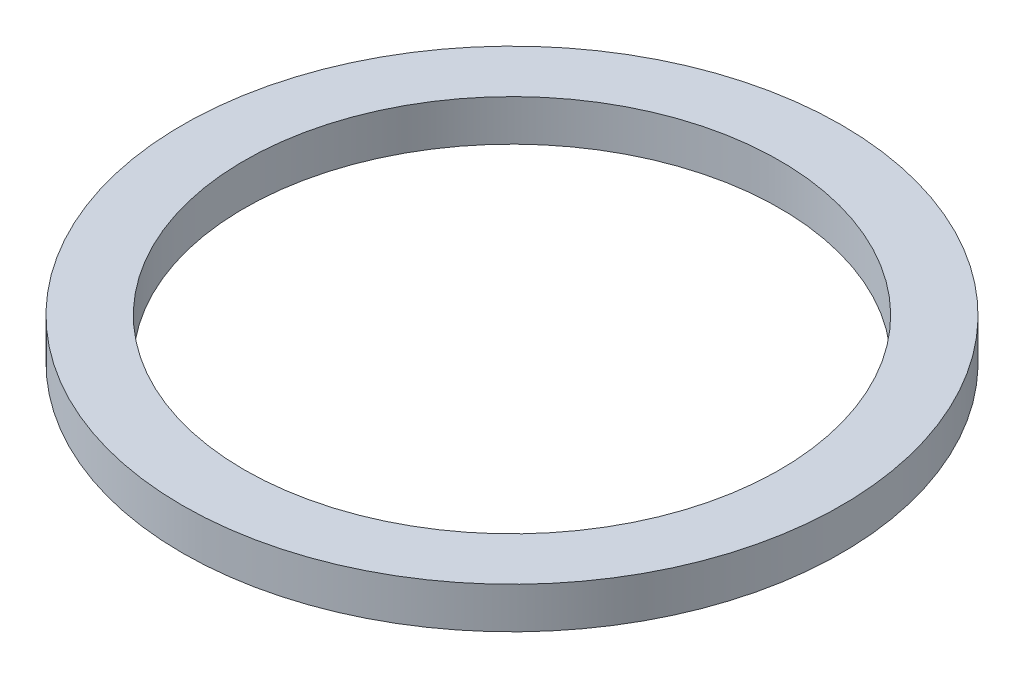
ISO-10303-21;
HEADER;
FILE_DESCRIPTION(('STEP AP214'),'2;1');
FILE_NAME('part.step','',(''),(''),'','','');
FILE_SCHEMA(('AUTOMOTIVE_DESIGN { 1 0 10303 214 1 1 1 1 }'));
ENDSEC;
DATA;
#1=APPLICATION_CONTEXT('core data for automotive mechanical design processes');
#2=APPLICATION_PROTOCOL_DEFINITION('international standard','automotive_design',2000,#1);
#3=PRODUCT_CONTEXT('',#1,'mechanical');
#4=PRODUCT('Part','Part','',(#3));
#5=PRODUCT_RELATED_PRODUCT_CATEGORY('part','',(#4));
#6=PRODUCT_DEFINITION_FORMATION('','',#4);
#7=PRODUCT_DEFINITION_CONTEXT('part definition',#1,'design');
#8=PRODUCT_DEFINITION('design','',#6,#7);
#9=PRODUCT_DEFINITION_SHAPE('','',#8);
#10=(LENGTH_UNIT() NAMED_UNIT(*) SI_UNIT(.MILLI.,.METRE.));
#11=(NAMED_UNIT(*) PLANE_ANGLE_UNIT() SI_UNIT($,.RADIAN.));
#12=(NAMED_UNIT(*) SI_UNIT($,.STERADIAN.) SOLID_ANGLE_UNIT());
#13=UNCERTAINTY_MEASURE_WITH_UNIT(LENGTH_MEASURE(1.E-05),#10,'distance_accuracy_value','');
#14=(GEOMETRIC_REPRESENTATION_CONTEXT(3) GLOBAL_UNCERTAINTY_ASSIGNED_CONTEXT((#13)) GLOBAL_UNIT_ASSIGNED_CONTEXT((#10,
#11,#12)) REPRESENTATION_CONTEXT('',''));
#15=CARTESIAN_POINT('',(0.,0.,0.));
#16=DIRECTION('',(0.,0.,1.));
#17=DIRECTION('',(1.,0.,0.));
#18=AXIS2_PLACEMENT_3D('',#15,#16,#17);
#19=CARTESIAN_POINT('',(0.,0.5,0.));
#20=DIRECTION('',(0.,1.,0.));
#21=DIRECTION('',(0.,0.,1.));
#22=AXIS2_PLACEMENT_3D('',#19,#20,#21);
#23=PLANE('',#22);
#24=CARTESIAN_POINT('',(0.,0.5,0.));
#25=DIRECTION('',(0.,1.,0.));
#26=DIRECTION('',(0.,0.,1.));
#27=AXIS2_PLACEMENT_3D('',#24,#25,#26);
#28=CIRCLE('',#27,4.);
#29=CARTESIAN_POINT('',(0.,0.5,4.));
#30=VERTEX_POINT('',#29);
#31=EDGE_CURVE('E10',#30,#30,#28,.T.);
#32=ORIENTED_EDGE('',*,*,#31,.T.);
#33=EDGE_LOOP('',(#32));
#34=FACE_BOUND('',#33,.T.);
#35=CARTESIAN_POINT('',(0.,0.5,0.));
#36=DIRECTION('',(0.,1.,0.));
#37=DIRECTION('',(0.,0.,1.));
#38=AXIS2_PLACEMENT_3D('',#35,#36,#37);
#39=CIRCLE('',#38,3.25);
#40=CARTESIAN_POINT('',(0.,0.5,3.25));
#41=VERTEX_POINT('',#40);
#42=EDGE_CURVE('E42',#41,#41,#39,.T.);
#43=ORIENTED_EDGE('',*,*,#42,.F.);
#44=EDGE_LOOP('',(#43));
#45=FACE_BOUND('',#44,.T.);
#46=ADVANCED_FACE('F31',(#34,#45),#23,.T.);
#47=CARTESIAN_POINT('',(0.,0.,0.));
#48=DIRECTION('',(0.,1.,0.));
#49=DIRECTION('',(0.,0.,1.));
#50=AXIS2_PLACEMENT_3D('',#47,#48,#49);
#51=PLANE('',#50);
#52=CARTESIAN_POINT('',(0.,0.,0.));
#53=DIRECTION('',(0.,1.,0.));
#54=DIRECTION('',(0.,0.,1.));
#55=AXIS2_PLACEMENT_3D('',#52,#53,#54);
#56=CIRCLE('',#55,4.);
#57=CARTESIAN_POINT('',(0.,0.,4.));
#58=VERTEX_POINT('',#57);
#59=EDGE_CURVE('E35',#58,#58,#56,.T.);
#60=ORIENTED_EDGE('',*,*,#59,.F.);
#61=EDGE_LOOP('',(#60));
#62=FACE_BOUND('',#61,.T.);
#63=CARTESIAN_POINT('',(0.,0.,0.));
#64=DIRECTION('',(0.,1.,0.));
#65=DIRECTION('',(0.,0.,1.));
#66=AXIS2_PLACEMENT_3D('',#63,#64,#65);
#67=CIRCLE('',#66,3.25);
#68=CARTESIAN_POINT('',(0.,0.,3.25));
#69=VERTEX_POINT('',#68);
#70=EDGE_CURVE('E44',#69,#69,#67,.T.);
#71=ORIENTED_EDGE('',*,*,#70,.T.);
#72=EDGE_LOOP('',(#71));
#73=FACE_BOUND('',#72,.T.);
#74=ADVANCED_FACE('F54',(#62,#73),#51,.F.);
#75=CARTESIAN_POINT('',(0.,0.5,0.));
#76=DIRECTION('',(0.,-1.,0.));
#77=DIRECTION('',(0.,0.,-1.));
#78=AXIS2_PLACEMENT_3D('',#75,#76,#77);
#79=CYLINDRICAL_SURFACE('',#78,4.);
#80=ORIENTED_EDGE('',*,*,#31,.F.);
#81=EDGE_LOOP('',(#80));
#82=FACE_BOUND('',#81,.T.);
#83=ORIENTED_EDGE('',*,*,#59,.T.);
#84=EDGE_LOOP('',(#83));
#85=FACE_BOUND('',#84,.T.);
#86=ADVANCED_FACE('F33',(#82,#85),#79,.T.);
#87=CARTESIAN_POINT('',(0.,0.5,0.));
#88=DIRECTION('',(0.,-1.,0.));
#89=DIRECTION('',(0.,0.,-1.));
#90=AXIS2_PLACEMENT_3D('',#87,#88,#89);
#91=CYLINDRICAL_SURFACE('',#90,3.25);
#92=ORIENTED_EDGE('',*,*,#42,.T.);
#93=EDGE_LOOP('',(#92));
#94=FACE_BOUND('',#93,.T.);
#95=ORIENTED_EDGE('',*,*,#70,.F.);
#96=EDGE_LOOP('',(#95));
#97=FACE_BOUND('',#96,.T.);
#98=ADVANCED_FACE('F50',(#94,#97),#91,.F.);
#99=CLOSED_SHELL('',(#46,#74,#86,#98));
#100=MANIFOLD_SOLID_BREP('B2',#99);
#101=ADVANCED_BREP_SHAPE_REPRESENTATION('',(#18,#100),#14);
#102=SHAPE_DEFINITION_REPRESENTATION(#9,#101);
ENDSEC;
END-ISO-10303-21;
